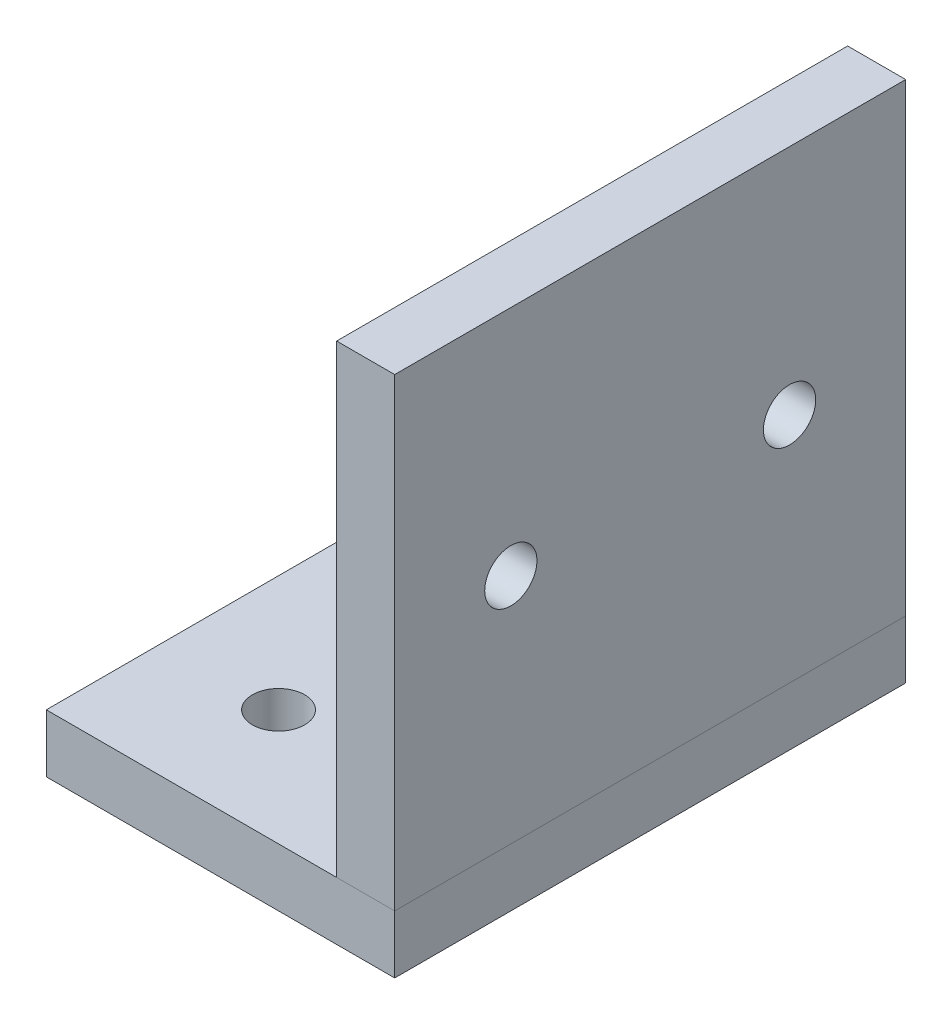
ISO-10303-21;
HEADER;
FILE_DESCRIPTION(('STEP AP214'),'2;1');
FILE_NAME('part.step','',(''),(''),'','','');
FILE_SCHEMA(('AUTOMOTIVE_DESIGN { 1 0 10303 214 1 1 1 1 }'));
ENDSEC;
DATA;
#1=APPLICATION_CONTEXT('core data for automotive mechanical design processes');
#2=APPLICATION_PROTOCOL_DEFINITION('international standard','automotive_design',2000,#1);
#3=PRODUCT_CONTEXT('',#1,'mechanical');
#4=PRODUCT('Part','Part','',(#3));
#5=PRODUCT_RELATED_PRODUCT_CATEGORY('part','',(#4));
#6=PRODUCT_DEFINITION_FORMATION('','',#4);
#7=PRODUCT_DEFINITION_CONTEXT('part definition',#1,'design');
#8=PRODUCT_DEFINITION('design','',#6,#7);
#9=PRODUCT_DEFINITION_SHAPE('','',#8);
#10=(LENGTH_UNIT() NAMED_UNIT(*) SI_UNIT(.MILLI.,.METRE.));
#11=(NAMED_UNIT(*) PLANE_ANGLE_UNIT() SI_UNIT($,.RADIAN.));
#12=(NAMED_UNIT(*) SI_UNIT($,.STERADIAN.) SOLID_ANGLE_UNIT());
#13=UNCERTAINTY_MEASURE_WITH_UNIT(LENGTH_MEASURE(1.E-05),#10,'distance_accuracy_value','');
#14=(GEOMETRIC_REPRESENTATION_CONTEXT(3) GLOBAL_UNCERTAINTY_ASSIGNED_CONTEXT((#13)) GLOBAL_UNIT_ASSIGNED_CONTEXT((#10,
#11,#12)) REPRESENTATION_CONTEXT('',''));
#15=CARTESIAN_POINT('',(0.,0.,0.));
#16=DIRECTION('',(0.,0.,1.));
#17=DIRECTION('',(1.,0.,0.));
#18=AXIS2_PLACEMENT_3D('',#15,#16,#17);
#19=CARTESIAN_POINT('',(15.,45.,-22.));
#20=DIRECTION('',(-1.,0.,0.));
#21=DIRECTION('',(0.,0.,1.));
#22=AXIS2_PLACEMENT_3D('',#19,#20,#21);
#23=PLANE('',#22);
#24=CARTESIAN_POINT('',(15.,25.,12.));
#25=DIRECTION('',(-1.,0.,0.));
#26=DIRECTION('',(0.,0.,1.));
#27=AXIS2_PLACEMENT_3D('',#24,#25,#26);
#28=CIRCLE('',#27,2.25000000000001);
#29=CARTESIAN_POINT('',(15.,25.,14.25));
#30=VERTEX_POINT('',#29);
#31=EDGE_CURVE('E115',#30,#30,#28,.T.);
#32=ORIENTED_EDGE('',*,*,#31,.T.);
#33=EDGE_LOOP('',(#32));
#34=FACE_BOUND('',#33,.T.);
#35=CARTESIAN_POINT('',(15.,25.,-12.));
#36=DIRECTION('',(-1.,0.,0.));
#37=DIRECTION('',(0.,0.,1.));
#38=AXIS2_PLACEMENT_3D('',#35,#36,#37);
#39=CIRCLE('',#38,2.25000000000001);
#40=CARTESIAN_POINT('',(15.,25.,-9.74999999999999));
#41=VERTEX_POINT('',#40);
#42=EDGE_CURVE('E126',#41,#41,#39,.T.);
#43=ORIENTED_EDGE('',*,*,#42,.T.);
#44=EDGE_LOOP('',(#43));
#45=FACE_BOUND('',#44,.T.);
#46=DIRECTION('',(0.,0.,-1.));
#47=VECTOR('',#46,1.);
#48=CARTESIAN_POINT('',(15.,5.,-22.));
#49=LINE('',#48,#47);
#50=CARTESIAN_POINT('',(15.,5.,22.));
#51=VERTEX_POINT('',#50);
#52=CARTESIAN_POINT('',(15.,5.,-22.));
#53=VERTEX_POINT('',#52);
#54=EDGE_CURVE('E112',#51,#53,#49,.T.);
#55=ORIENTED_EDGE('',*,*,#54,.T.);
#56=DIRECTION('',(0.,-1.,0.));
#57=VECTOR('',#56,1.);
#58=CARTESIAN_POINT('',(15.,45.,-22.));
#59=LINE('',#58,#57);
#60=CARTESIAN_POINT('',(15.,45.,-22.));
#61=VERTEX_POINT('',#60);
#62=EDGE_CURVE('E12',#61,#53,#59,.T.);
#63=ORIENTED_EDGE('',*,*,#62,.F.);
#64=DIRECTION('',(0.,0.,-1.));
#65=VECTOR('',#64,1.);
#66=CARTESIAN_POINT('',(15.,45.,-22.));
#67=LINE('',#66,#65);
#68=CARTESIAN_POINT('',(15.,45.,22.));
#69=VERTEX_POINT('',#68);
#70=EDGE_CURVE('E100',#69,#61,#67,.T.);
#71=ORIENTED_EDGE('',*,*,#70,.F.);
#72=DIRECTION('',(0.,-1.,0.));
#73=VECTOR('',#72,1.);
#74=CARTESIAN_POINT('',(15.,45.,22.));
#75=LINE('',#74,#73);
#76=EDGE_CURVE('E108',#69,#51,#75,.T.);
#77=ORIENTED_EDGE('',*,*,#76,.T.);
#78=EDGE_LOOP('',(#55,#63,#71,#77));
#79=FACE_BOUND('',#78,.T.);
#80=ADVANCED_FACE('F49',(#34,#45,#79),#23,.F.);
#81=CARTESIAN_POINT('',(15.,45.,-22.));
#82=DIRECTION('',(0.,0.,1.));
#83=DIRECTION('',(1.,0.,0.));
#84=AXIS2_PLACEMENT_3D('',#81,#82,#83);
#85=PLANE('',#84);
#86=DIRECTION('',(-1.,0.,0.));
#87=VECTOR('',#86,1.);
#88=CARTESIAN_POINT('',(15.,5.,-22.));
#89=LINE('',#88,#87);
#90=CARTESIAN_POINT('',(9.99999999999999,5.,-22.));
#91=VERTEX_POINT('',#90);
#92=EDGE_CURVE('E104',#53,#91,#89,.T.);
#93=ORIENTED_EDGE('',*,*,#92,.T.);
#94=DIRECTION('',(0.,-1.,0.));
#95=VECTOR('',#94,1.);
#96=CARTESIAN_POINT('',(9.99999999999999,45.,-22.));
#97=LINE('',#96,#95);
#98=CARTESIAN_POINT('',(9.99999999999999,45.,-22.));
#99=VERTEX_POINT('',#98);
#100=EDGE_CURVE('E57',#99,#91,#97,.T.);
#101=ORIENTED_EDGE('',*,*,#100,.F.);
#102=DIRECTION('',(-1.,0.,0.));
#103=VECTOR('',#102,1.);
#104=CARTESIAN_POINT('',(15.,45.,-22.));
#105=LINE('',#104,#103);
#106=EDGE_CURVE('E95',#61,#99,#105,.T.);
#107=ORIENTED_EDGE('',*,*,#106,.F.);
#108=ORIENTED_EDGE('',*,*,#62,.T.);
#109=EDGE_LOOP('',(#93,#101,#107,#108));
#110=FACE_BOUND('',#109,.T.);
#111=ADVANCED_FACE('F103',(#110),#85,.F.);
#112=CARTESIAN_POINT('',(9.99999999999999,45.,-22.));
#113=DIRECTION('',(1.,0.,0.));
#114=DIRECTION('',(0.,0.,-1.));
#115=AXIS2_PLACEMENT_3D('',#112,#113,#114);
#116=PLANE('',#115);
#117=CARTESIAN_POINT('',(9.99999999999999,25.,12.));
#118=DIRECTION('',(-1.,0.,0.));
#119=DIRECTION('',(0.,0.,1.));
#120=AXIS2_PLACEMENT_3D('',#117,#118,#119);
#121=CIRCLE('',#120,2.25000000000001);
#122=CARTESIAN_POINT('',(9.99999999999999,25.,14.25));
#123=VERTEX_POINT('',#122);
#124=EDGE_CURVE('E132',#123,#123,#121,.T.);
#125=ORIENTED_EDGE('',*,*,#124,.F.);
#126=EDGE_LOOP('',(#125));
#127=FACE_BOUND('',#126,.T.);
#128=CARTESIAN_POINT('',(9.99999999999999,25.,-12.));
#129=DIRECTION('',(-1.,0.,0.));
#130=DIRECTION('',(0.,0.,1.));
#131=AXIS2_PLACEMENT_3D('',#128,#129,#130);
#132=CIRCLE('',#131,2.25000000000001);
#133=CARTESIAN_POINT('',(9.99999999999999,25.,-9.74999999999999));
#134=VERTEX_POINT('',#133);
#135=EDGE_CURVE('E129',#134,#134,#132,.T.);
#136=ORIENTED_EDGE('',*,*,#135,.F.);
#137=EDGE_LOOP('',(#136));
#138=FACE_BOUND('',#137,.T.);
#139=DIRECTION('',(0.,0.,1.));
#140=VECTOR('',#139,1.);
#141=CARTESIAN_POINT('',(9.99999999999999,5.,-22.));
#142=LINE('',#141,#140);
#143=CARTESIAN_POINT('',(9.99999999999999,5.,22.));
#144=VERTEX_POINT('',#143);
#145=EDGE_CURVE('E82',#91,#144,#142,.T.);
#146=ORIENTED_EDGE('',*,*,#145,.T.);
#147=DIRECTION('',(0.,-1.,0.));
#148=VECTOR('',#147,1.);
#149=CARTESIAN_POINT('',(9.99999999999999,45.,22.));
#150=LINE('',#149,#148);
#151=CARTESIAN_POINT('',(9.99999999999999,45.,22.));
#152=VERTEX_POINT('',#151);
#153=EDGE_CURVE('E105',#152,#144,#150,.T.);
#154=ORIENTED_EDGE('',*,*,#153,.F.);
#155=DIRECTION('',(0.,0.,1.));
#156=VECTOR('',#155,1.);
#157=CARTESIAN_POINT('',(9.99999999999999,45.,-22.));
#158=LINE('',#157,#156);
#159=EDGE_CURVE('E98',#99,#152,#158,.T.);
#160=ORIENTED_EDGE('',*,*,#159,.F.);
#161=ORIENTED_EDGE('',*,*,#100,.T.);
#162=EDGE_LOOP('',(#146,#154,#160,#161));
#163=FACE_BOUND('',#162,.T.);
#164=ADVANCED_FACE('F106',(#127,#138,#163),#116,.F.);
#165=CARTESIAN_POINT('',(15.,45.,22.));
#166=DIRECTION('',(0.,0.,-1.));
#167=DIRECTION('',(-1.,0.,0.));
#168=AXIS2_PLACEMENT_3D('',#165,#166,#167);
#169=PLANE('',#168);
#170=DIRECTION('',(1.,0.,0.));
#171=VECTOR('',#170,1.);
#172=CARTESIAN_POINT('',(15.,5.,22.));
#173=LINE('',#172,#171);
#174=EDGE_CURVE('E88',#144,#51,#173,.T.);
#175=ORIENTED_EDGE('',*,*,#174,.T.);
#176=ORIENTED_EDGE('',*,*,#76,.F.);
#177=DIRECTION('',(1.,0.,0.));
#178=VECTOR('',#177,1.);
#179=CARTESIAN_POINT('',(15.,45.,22.));
#180=LINE('',#179,#178);
#181=EDGE_CURVE('E65',#152,#69,#180,.T.);
#182=ORIENTED_EDGE('',*,*,#181,.F.);
#183=ORIENTED_EDGE('',*,*,#153,.T.);
#184=EDGE_LOOP('',(#175,#176,#182,#183));
#185=FACE_BOUND('',#184,.T.);
#186=ADVANCED_FACE('F120',(#185),#169,.F.);
#187=CARTESIAN_POINT('',(0.,45.,0.));
#188=DIRECTION('',(0.,-1.,0.));
#189=DIRECTION('',(0.,0.,-1.));
#190=AXIS2_PLACEMENT_3D('',#187,#188,#189);
#191=PLANE('',#190);
#192=ORIENTED_EDGE('',*,*,#70,.T.);
#193=ORIENTED_EDGE('',*,*,#106,.T.);
#194=ORIENTED_EDGE('',*,*,#159,.T.);
#195=ORIENTED_EDGE('',*,*,#181,.T.);
#196=EDGE_LOOP('',(#192,#193,#194,#195));
#197=FACE_BOUND('',#196,.T.);
#198=ADVANCED_FACE('F96',(#197),#191,.F.);
#199=CARTESIAN_POINT('',(0.,5.,0.));
#200=DIRECTION('',(0.,-1.,0.));
#201=DIRECTION('',(0.,0.,-1.));
#202=AXIS2_PLACEMENT_3D('',#199,#200,#201);
#203=PLANE('',#202);
#204=ORIENTED_EDGE('',*,*,#54,.F.);
#205=ORIENTED_EDGE('',*,*,#174,.F.);
#206=ORIENTED_EDGE('',*,*,#145,.F.);
#207=ORIENTED_EDGE('',*,*,#92,.F.);
#208=EDGE_LOOP('',(#204,#205,#206,#207));
#209=FACE_BOUND('',#208,.T.);
#210=ADVANCED_FACE('F123',(#209),#203,.T.);
#211=CARTESIAN_POINT('',(15.,25.,-12.));
#212=DIRECTION('',(-1.,0.,0.));
#213=DIRECTION('',(0.,0.,1.));
#214=AXIS2_PLACEMENT_3D('',#211,#212,#213);
#215=CYLINDRICAL_SURFACE('',#214,2.25000000000001);
#216=ORIENTED_EDGE('',*,*,#42,.F.);
#217=EDGE_LOOP('',(#216));
#218=FACE_BOUND('',#217,.T.);
#219=ORIENTED_EDGE('',*,*,#135,.T.);
#220=EDGE_LOOP('',(#219));
#221=FACE_BOUND('',#220,.T.);
#222=ADVANCED_FACE('F143',(#218,#221),#215,.F.);
#223=CARTESIAN_POINT('',(15.,25.,12.));
#224=DIRECTION('',(-1.,0.,0.));
#225=DIRECTION('',(0.,0.,1.));
#226=AXIS2_PLACEMENT_3D('',#223,#224,#225);
#227=CYLINDRICAL_SURFACE('',#226,2.25000000000001);
#228=ORIENTED_EDGE('',*,*,#31,.F.);
#229=EDGE_LOOP('',(#228));
#230=FACE_BOUND('',#229,.T.);
#231=ORIENTED_EDGE('',*,*,#124,.T.);
#232=EDGE_LOOP('',(#231));
#233=FACE_BOUND('',#232,.T.);
#234=ADVANCED_FACE('F140',(#230,#233),#227,.F.);
#235=CLOSED_SHELL('',(#80,#111,#164,#186,#198,#210,#222,#234));
#236=MANIFOLD_SOLID_BREP('B2',#235);
#237=CARTESIAN_POINT('',(15.,5.,22.));
#238=DIRECTION('',(-1.,0.,0.));
#239=DIRECTION('',(0.,0.,1.));
#240=AXIS2_PLACEMENT_3D('',#237,#238,#239);
#241=PLANE('',#240);
#242=DIRECTION('',(0.,0.,-1.));
#243=VECTOR('',#242,1.);
#244=CARTESIAN_POINT('',(15.,0.,22.));
#245=LINE('',#244,#243);
#246=CARTESIAN_POINT('',(15.,0.,22.));
#247=VERTEX_POINT('',#246);
#248=CARTESIAN_POINT('',(15.,0.,-22.));
#249=VERTEX_POINT('',#248);
#250=EDGE_CURVE('E294',#247,#249,#245,.T.);
#251=ORIENTED_EDGE('',*,*,#250,.T.);
#252=DIRECTION('',(0.,-1.,0.));
#253=VECTOR('',#252,1.);
#254=CARTESIAN_POINT('',(15.,5.,-22.));
#255=LINE('',#254,#253);
#256=CARTESIAN_POINT('',(15.,5.,-22.));
#257=VERTEX_POINT('',#256);
#258=EDGE_CURVE('E47',#257,#249,#255,.T.);
#259=ORIENTED_EDGE('',*,*,#258,.F.);
#260=DIRECTION('',(0.,0.,-1.));
#261=VECTOR('',#260,1.);
#262=CARTESIAN_POINT('',(15.,5.,22.));
#263=LINE('',#262,#261);
#264=CARTESIAN_POINT('',(15.,5.,22.));
#265=VERTEX_POINT('',#264);
#266=EDGE_CURVE('E282',#265,#257,#263,.T.);
#267=ORIENTED_EDGE('',*,*,#266,.F.);
#268=DIRECTION('',(0.,-1.,0.));
#269=VECTOR('',#268,1.);
#270=CARTESIAN_POINT('',(15.,5.,22.));
#271=LINE('',#270,#269);
#272=EDGE_CURVE('E290',#265,#247,#271,.T.);
#273=ORIENTED_EDGE('',*,*,#272,.T.);
#274=EDGE_LOOP('',(#251,#259,#267,#273));
#275=FACE_BOUND('',#274,.T.);
#276=ADVANCED_FACE('F231',(#275),#241,.F.);
#277=CARTESIAN_POINT('',(-15.,5.,-22.));
#278=DIRECTION('',(0.,0.,1.));
#279=DIRECTION('',(1.,0.,0.));
#280=AXIS2_PLACEMENT_3D('',#277,#278,#279);
#281=PLANE('',#280);
#282=DIRECTION('',(-1.,0.,0.));
#283=VECTOR('',#282,1.);
#284=CARTESIAN_POINT('',(-15.,0.,-22.));
#285=LINE('',#284,#283);
#286=CARTESIAN_POINT('',(-15.,0.,-22.));
#287=VERTEX_POINT('',#286);
#288=EDGE_CURVE('E286',#249,#287,#285,.T.);
#289=ORIENTED_EDGE('',*,*,#288,.T.);
#290=DIRECTION('',(0.,-1.,0.));
#291=VECTOR('',#290,1.);
#292=CARTESIAN_POINT('',(-15.,5.,-22.));
#293=LINE('',#292,#291);
#294=CARTESIAN_POINT('',(-15.,5.,-22.));
#295=VERTEX_POINT('',#294);
#296=EDGE_CURVE('E239',#295,#287,#293,.T.);
#297=ORIENTED_EDGE('',*,*,#296,.F.);
#298=DIRECTION('',(-1.,0.,0.));
#299=VECTOR('',#298,1.);
#300=CARTESIAN_POINT('',(-15.,5.,-22.));
#301=LINE('',#300,#299);
#302=EDGE_CURVE('E277',#257,#295,#301,.T.);
#303=ORIENTED_EDGE('',*,*,#302,.F.);
#304=ORIENTED_EDGE('',*,*,#258,.T.);
#305=EDGE_LOOP('',(#289,#297,#303,#304));
#306=FACE_BOUND('',#305,.T.);
#307=ADVANCED_FACE('F285',(#306),#281,.F.);
#308=CARTESIAN_POINT('',(-15.,5.,22.));
#309=DIRECTION('',(1.,0.,0.));
#310=DIRECTION('',(0.,0.,-1.));
#311=AXIS2_PLACEMENT_3D('',#308,#309,#310);
#312=PLANE('',#311);
#313=DIRECTION('',(0.,0.,1.));
#314=VECTOR('',#313,1.);
#315=CARTESIAN_POINT('',(-15.,0.,22.));
#316=LINE('',#315,#314);
#317=CARTESIAN_POINT('',(-15.,0.,22.));
#318=VERTEX_POINT('',#317);
#319=EDGE_CURVE('E264',#287,#318,#316,.T.);
#320=ORIENTED_EDGE('',*,*,#319,.T.);
#321=DIRECTION('',(0.,-1.,0.));
#322=VECTOR('',#321,1.);
#323=CARTESIAN_POINT('',(-15.,5.,22.));
#324=LINE('',#323,#322);
#325=CARTESIAN_POINT('',(-15.,5.,22.));
#326=VERTEX_POINT('',#325);
#327=EDGE_CURVE('E287',#326,#318,#324,.T.);
#328=ORIENTED_EDGE('',*,*,#327,.F.);
#329=DIRECTION('',(0.,0.,1.));
#330=VECTOR('',#329,1.);
#331=CARTESIAN_POINT('',(-15.,5.,22.));
#332=LINE('',#331,#330);
#333=EDGE_CURVE('E280',#295,#326,#332,.T.);
#334=ORIENTED_EDGE('',*,*,#333,.F.);
#335=ORIENTED_EDGE('',*,*,#296,.T.);
#336=EDGE_LOOP('',(#320,#328,#334,#335));
#337=FACE_BOUND('',#336,.T.);
#338=ADVANCED_FACE('F288',(#337),#312,.F.);
#339=CARTESIAN_POINT('',(-15.,5.,22.));
#340=DIRECTION('',(0.,0.,-1.));
#341=DIRECTION('',(-1.,0.,0.));
#342=AXIS2_PLACEMENT_3D('',#339,#340,#341);
#343=PLANE('',#342);
#344=DIRECTION('',(1.,0.,0.));
#345=VECTOR('',#344,1.);
#346=CARTESIAN_POINT('',(-15.,0.,22.));
#347=LINE('',#346,#345);
#348=EDGE_CURVE('E270',#318,#247,#347,.T.);
#349=ORIENTED_EDGE('',*,*,#348,.T.);
#350=ORIENTED_EDGE('',*,*,#272,.F.);
#351=DIRECTION('',(1.,0.,0.));
#352=VECTOR('',#351,1.);
#353=CARTESIAN_POINT('',(-15.,5.,22.));
#354=LINE('',#353,#352);
#355=EDGE_CURVE('E247',#326,#265,#354,.T.);
#356=ORIENTED_EDGE('',*,*,#355,.F.);
#357=ORIENTED_EDGE('',*,*,#327,.T.);
#358=EDGE_LOOP('',(#349,#350,#356,#357));
#359=FACE_BOUND('',#358,.T.);
#360=ADVANCED_FACE('F302',(#359),#343,.F.);
#361=CARTESIAN_POINT('',(0.,5.,0.));
#362=DIRECTION('',(0.,-1.,0.));
#363=DIRECTION('',(0.,0.,-1.));
#364=AXIS2_PLACEMENT_3D('',#361,#362,#363);
#365=PLANE('',#364);
#366=CARTESIAN_POINT('',(-5.00000000000001,5.,12.));
#367=DIRECTION('',(0.,1.,0.));
#368=DIRECTION('',(0.,0.,1.));
#369=AXIS2_PLACEMENT_3D('',#366,#367,#368);
#370=CIRCLE('',#369,2.25);
#371=CARTESIAN_POINT('',(-5.00000000000001,5.,14.25));
#372=VERTEX_POINT('',#371);
#373=EDGE_CURVE('E314',#372,#372,#370,.T.);
#374=ORIENTED_EDGE('',*,*,#373,.F.);
#375=EDGE_LOOP('',(#374));
#376=FACE_BOUND('',#375,.T.);
#377=CARTESIAN_POINT('',(-5.00000000000001,5.,-12.));
#378=DIRECTION('',(0.,1.,0.));
#379=DIRECTION('',(0.,0.,1.));
#380=AXIS2_PLACEMENT_3D('',#377,#378,#379);
#381=CIRCLE('',#380,2.25);
#382=CARTESIAN_POINT('',(-5.00000000000001,5.,-9.75));
#383=VERTEX_POINT('',#382);
#384=EDGE_CURVE('E311',#383,#383,#381,.T.);
#385=ORIENTED_EDGE('',*,*,#384,.F.);
#386=EDGE_LOOP('',(#385));
#387=FACE_BOUND('',#386,.T.);
#388=ORIENTED_EDGE('',*,*,#266,.T.);
#389=ORIENTED_EDGE('',*,*,#302,.T.);
#390=ORIENTED_EDGE('',*,*,#333,.T.);
#391=ORIENTED_EDGE('',*,*,#355,.T.);
#392=EDGE_LOOP('',(#388,#389,#390,#391));
#393=FACE_BOUND('',#392,.T.);
#394=ADVANCED_FACE('F278',(#376,#387,#393),#365,.F.);
#395=CARTESIAN_POINT('',(0.,0.,0.));
#396=DIRECTION('',(0.,-1.,0.));
#397=DIRECTION('',(0.,0.,-1.));
#398=AXIS2_PLACEMENT_3D('',#395,#396,#397);
#399=PLANE('',#398);
#400=CARTESIAN_POINT('',(-5.00000000000001,0.,12.));
#401=DIRECTION('',(0.,1.,0.));
#402=DIRECTION('',(0.,0.,1.));
#403=AXIS2_PLACEMENT_3D('',#400,#401,#402);
#404=CIRCLE('',#403,2.25);
#405=CARTESIAN_POINT('',(-5.00000000000001,0.,14.25));
#406=VERTEX_POINT('',#405);
#407=EDGE_CURVE('E297',#406,#406,#404,.T.);
#408=ORIENTED_EDGE('',*,*,#407,.T.);
#409=EDGE_LOOP('',(#408));
#410=FACE_BOUND('',#409,.T.);
#411=CARTESIAN_POINT('',(-5.00000000000001,0.,-12.));
#412=DIRECTION('',(0.,1.,0.));
#413=DIRECTION('',(0.,0.,1.));
#414=AXIS2_PLACEMENT_3D('',#411,#412,#413);
#415=CIRCLE('',#414,2.25);
#416=CARTESIAN_POINT('',(-5.00000000000001,0.,-9.75));
#417=VERTEX_POINT('',#416);
#418=EDGE_CURVE('E308',#417,#417,#415,.T.);
#419=ORIENTED_EDGE('',*,*,#418,.T.);
#420=EDGE_LOOP('',(#419));
#421=FACE_BOUND('',#420,.T.);
#422=ORIENTED_EDGE('',*,*,#250,.F.);
#423=ORIENTED_EDGE('',*,*,#348,.F.);
#424=ORIENTED_EDGE('',*,*,#319,.F.);
#425=ORIENTED_EDGE('',*,*,#288,.F.);
#426=EDGE_LOOP('',(#422,#423,#424,#425));
#427=FACE_BOUND('',#426,.T.);
#428=ADVANCED_FACE('F305',(#410,#421,#427),#399,.T.);
#429=CARTESIAN_POINT('',(-5.00000000000001,0.,-12.));
#430=DIRECTION('',(0.,1.,0.));
#431=DIRECTION('',(0.,0.,1.));
#432=AXIS2_PLACEMENT_3D('',#429,#430,#431);
#433=CYLINDRICAL_SURFACE('',#432,2.25);
#434=ORIENTED_EDGE('',*,*,#418,.F.);
#435=EDGE_LOOP('',(#434));
#436=FACE_BOUND('',#435,.T.);
#437=ORIENTED_EDGE('',*,*,#384,.T.);
#438=EDGE_LOOP('',(#437));
#439=FACE_BOUND('',#438,.T.);
#440=ADVANCED_FACE('F325',(#436,#439),#433,.F.);
#441=CARTESIAN_POINT('',(-5.00000000000001,0.,12.));
#442=DIRECTION('',(0.,1.,0.));
#443=DIRECTION('',(0.,0.,1.));
#444=AXIS2_PLACEMENT_3D('',#441,#442,#443);
#445=CYLINDRICAL_SURFACE('',#444,2.25);
#446=ORIENTED_EDGE('',*,*,#407,.F.);
#447=EDGE_LOOP('',(#446));
#448=FACE_BOUND('',#447,.T.);
#449=ORIENTED_EDGE('',*,*,#373,.T.);
#450=EDGE_LOOP('',(#449));
#451=FACE_BOUND('',#450,.T.);
#452=ADVANCED_FACE('F322',(#448,#451),#445,.F.);
#453=CLOSED_SHELL('',(#276,#307,#338,#360,#394,#428,#440,#452));
#454=MANIFOLD_SOLID_BREP('B6',#453);
#455=ADVANCED_BREP_SHAPE_REPRESENTATION('',(#18,#236,#454),#14);
#456=SHAPE_DEFINITION_REPRESENTATION(#9,#455);
ENDSEC;
END-ISO-10303-21;
